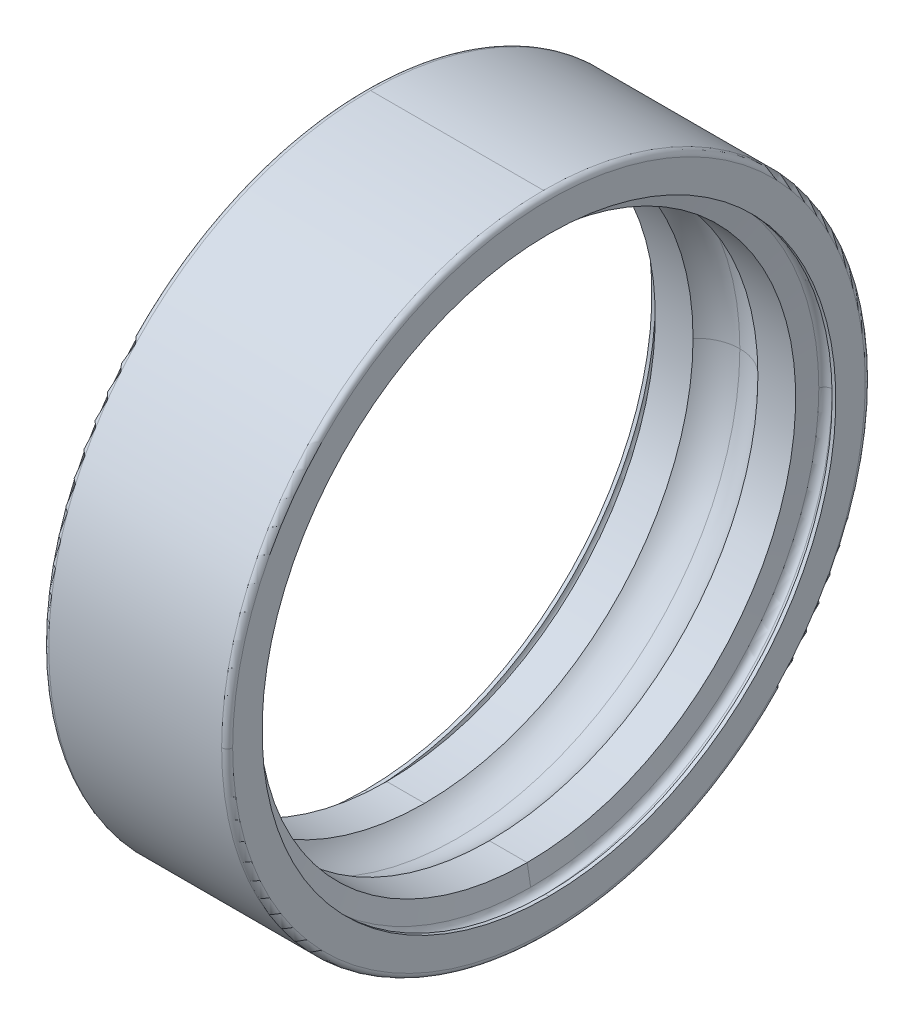
ISO-10303-21;
HEADER;
FILE_DESCRIPTION(('STEP AP214'),'2;1');
FILE_NAME('part.step','',(''),(''),'','','');
FILE_SCHEMA(('AUTOMOTIVE_DESIGN { 1 0 10303 214 1 1 1 1 }'));
ENDSEC;
DATA;
#1=APPLICATION_CONTEXT('core data for automotive mechanical design processes');
#2=APPLICATION_PROTOCOL_DEFINITION('international standard','automotive_design',2000,#1);
#3=PRODUCT_CONTEXT('',#1,'mechanical');
#4=PRODUCT('Part','Part','',(#3));
#5=PRODUCT_RELATED_PRODUCT_CATEGORY('part','',(#4));
#6=PRODUCT_DEFINITION_FORMATION('','',#4);
#7=PRODUCT_DEFINITION_CONTEXT('part definition',#1,'design');
#8=PRODUCT_DEFINITION('design','',#6,#7);
#9=PRODUCT_DEFINITION_SHAPE('','',#8);
#10=(LENGTH_UNIT() NAMED_UNIT(*) SI_UNIT(.MILLI.,.METRE.));
#11=(NAMED_UNIT(*) PLANE_ANGLE_UNIT() SI_UNIT($,.RADIAN.));
#12=(NAMED_UNIT(*) SI_UNIT($,.STERADIAN.) SOLID_ANGLE_UNIT());
#13=UNCERTAINTY_MEASURE_WITH_UNIT(LENGTH_MEASURE(1.E-05),#10,'distance_accuracy_value','');
#14=(GEOMETRIC_REPRESENTATION_CONTEXT(3) GLOBAL_UNCERTAINTY_ASSIGNED_CONTEXT((#13)) GLOBAL_UNIT_ASSIGNED_CONTEXT((#10,
#11,#12)) REPRESENTATION_CONTEXT('',''));
#15=CARTESIAN_POINT('',(0.,0.,0.));
#16=DIRECTION('',(0.,0.,1.));
#17=DIRECTION('',(1.,0.,0.));
#18=AXIS2_PLACEMENT_3D('',#15,#16,#17);
#19=CARTESIAN_POINT('',(9.4,0.,0.));
#20=DIRECTION('',(1.,0.,0.));
#21=DIRECTION('',(0.,0.,-1.));
#22=AXIS2_PLACEMENT_3D('',#19,#20,#21);
#23=TOROIDAL_SURFACE('',#22,15.6,0.4);
#24=CARTESIAN_POINT('',(9.4,0.,0.));
#25=DIRECTION('',(1.,0.,0.));
#26=DIRECTION('',(0.,0.,1.));
#27=AXIS2_PLACEMENT_3D('',#24,#25,#26);
#28=CIRCLE('',#27,16.);
#29=CARTESIAN_POINT('',(9.4,0.,-16.));
#30=VERTEX_POINT('',#29);
#31=CARTESIAN_POINT('',(9.4,0.,16.));
#32=VERTEX_POINT('',#31);
#33=EDGE_CURVE('E415',#30,#32,#28,.T.);
#34=ORIENTED_EDGE('',*,*,#33,.T.);
#35=CARTESIAN_POINT('',(9.4,0.,15.6));
#36=DIRECTION('',(0.,-1.,0.));
#37=DIRECTION('',(0.,0.,1.));
#38=AXIS2_PLACEMENT_3D('',#35,#36,#37);
#39=CIRCLE('',#38,0.4);
#40=CARTESIAN_POINT('',(9.00607689879512,0.,15.6694592710668));
#41=VERTEX_POINT('',#40);
#42=EDGE_CURVE('E300',#32,#41,#39,.T.);
#43=ORIENTED_EDGE('',*,*,#42,.T.);
#44=CARTESIAN_POINT('',(9.00607689879512,0.,0.));
#45=DIRECTION('',(1.,0.,0.));
#46=DIRECTION('',(0.,1.,0.));
#47=AXIS2_PLACEMENT_3D('',#44,#45,#46);
#48=CIRCLE('',#47,15.6694592710668);
#49=CARTESIAN_POINT('',(9.00607689879512,15.6694592710668,0.));
#50=VERTEX_POINT('',#49);
#51=EDGE_CURVE('E31',#50,#41,#48,.T.);
#52=ORIENTED_EDGE('',*,*,#51,.F.);
#53=CARTESIAN_POINT('',(9.00607689879512,0.,0.));
#54=DIRECTION('',(1.,0.,0.));
#55=DIRECTION('',(0.,1.,0.));
#56=AXIS2_PLACEMENT_3D('',#53,#54,#55);
#57=CIRCLE('',#56,15.6694592710668);
#58=CARTESIAN_POINT('',(9.00607689879512,0.,-15.6694592710668));
#59=VERTEX_POINT('',#58);
#60=EDGE_CURVE('E215',#59,#50,#57,.T.);
#61=ORIENTED_EDGE('',*,*,#60,.F.);
#62=CARTESIAN_POINT('',(9.4,0.,-15.6));
#63=DIRECTION('',(0.,-1.,0.));
#64=DIRECTION('',(0.,0.,-1.));
#65=AXIS2_PLACEMENT_3D('',#62,#63,#64);
#66=CIRCLE('',#65,0.4);
#67=EDGE_CURVE('E289',#59,#30,#66,.T.);
#68=ORIENTED_EDGE('',*,*,#67,.T.);
#69=EDGE_LOOP('',(#34,#43,#52,#61,#68));
#70=FACE_BOUND('',#69,.T.);
#71=ADVANCED_FACE('F16',(#70),#23,.F.);
#72=CARTESIAN_POINT('',(9.9,0.,0.));
#73=DIRECTION('',(1.,0.,0.));
#74=DIRECTION('',(0.,1.,0.));
#75=AXIS2_PLACEMENT_3D('',#72,#73,#74);
#76=CYLINDRICAL_SURFACE('',#75,15.6);
#77=DIRECTION('',(1.,0.,0.));
#78=VECTOR('',#77,1.);
#79=CARTESIAN_POINT('',(9.9,15.6,0.));
#80=LINE('',#79,#78);
#81=CARTESIAN_POINT('',(9.8,15.6,0.));
#82=VERTEX_POINT('',#81);
#83=CARTESIAN_POINT('',(10.,15.6,0.));
#84=VERTEX_POINT('',#83);
#85=EDGE_CURVE('E302',#82,#84,#80,.T.);
#86=ORIENTED_EDGE('',*,*,#85,.T.);
#87=CARTESIAN_POINT('',(10.,0.,0.));
#88=DIRECTION('',(1.,0.,0.));
#89=DIRECTION('',(0.,1.,0.));
#90=AXIS2_PLACEMENT_3D('',#87,#88,#89);
#91=CIRCLE('',#90,15.6);
#92=CARTESIAN_POINT('',(10.,-15.6,0.));
#93=VERTEX_POINT('',#92);
#94=EDGE_CURVE('E11',#84,#93,#91,.T.);
#95=ORIENTED_EDGE('',*,*,#94,.T.);
#96=DIRECTION('',(-1.,0.,0.));
#97=VECTOR('',#96,1.);
#98=CARTESIAN_POINT('',(9.9,-15.6,0.));
#99=LINE('',#98,#97);
#100=CARTESIAN_POINT('',(9.8,-15.6,0.));
#101=VERTEX_POINT('',#100);
#102=EDGE_CURVE('E307',#93,#101,#99,.T.);
#103=ORIENTED_EDGE('',*,*,#102,.T.);
#104=CARTESIAN_POINT('',(9.8,0.,0.));
#105=DIRECTION('',(1.,0.,0.));
#106=DIRECTION('',(0.,1.,0.));
#107=AXIS2_PLACEMENT_3D('',#104,#105,#106);
#108=CIRCLE('',#107,15.6);
#109=CARTESIAN_POINT('',(9.8,0.,15.6));
#110=VERTEX_POINT('',#109);
#111=EDGE_CURVE('E278',#110,#101,#108,.T.);
#112=ORIENTED_EDGE('',*,*,#111,.F.);
#113=CARTESIAN_POINT('',(9.8,0.,0.));
#114=DIRECTION('',(1.,0.,0.));
#115=DIRECTION('',(0.,1.,0.));
#116=AXIS2_PLACEMENT_3D('',#113,#114,#115);
#117=CIRCLE('',#116,15.6);
#118=EDGE_CURVE('E379',#82,#110,#117,.T.);
#119=ORIENTED_EDGE('',*,*,#118,.F.);
#120=EDGE_LOOP('',(#86,#95,#103,#112,#119));
#121=FACE_BOUND('',#120,.T.);
#122=ADVANCED_FACE('F439',(#121),#76,.F.);
#123=CARTESIAN_POINT('',(10.,16.4,0.));
#124=DIRECTION('',(1.,0.,0.));
#125=DIRECTION('',(0.,1.,0.));
#126=AXIS2_PLACEMENT_3D('',#123,#124,#125);
#127=PLANE('',#126);
#128=ORIENTED_EDGE('',*,*,#94,.F.);
#129=CARTESIAN_POINT('',(10.,0.,0.));
#130=DIRECTION('',(1.,0.,0.));
#131=DIRECTION('',(0.,1.,0.));
#132=AXIS2_PLACEMENT_3D('',#129,#130,#131);
#133=CIRCLE('',#132,15.6);
#134=EDGE_CURVE('E310',#93,#84,#133,.T.);
#135=ORIENTED_EDGE('',*,*,#134,.F.);
#136=EDGE_LOOP('',(#128,#135));
#137=FACE_BOUND('',#136,.T.);
#138=CARTESIAN_POINT('',(10.,0.,0.));
#139=DIRECTION('',(1.,0.,0.));
#140=DIRECTION('',(0.,1.,0.));
#141=AXIS2_PLACEMENT_3D('',#138,#139,#140);
#142=CIRCLE('',#141,17.2);
#143=CARTESIAN_POINT('',(10.,0.,17.2));
#144=VERTEX_POINT('',#143);
#145=CARTESIAN_POINT('',(10.,0.,-17.2));
#146=VERTEX_POINT('',#145);
#147=EDGE_CURVE('E19',#144,#146,#142,.T.);
#148=ORIENTED_EDGE('',*,*,#147,.T.);
#149=CARTESIAN_POINT('',(10.,0.,0.));
#150=DIRECTION('',(1.,0.,0.));
#151=DIRECTION('',(0.,1.,0.));
#152=AXIS2_PLACEMENT_3D('',#149,#150,#151);
#153=CIRCLE('',#152,17.2);
#154=EDGE_CURVE('E323',#146,#144,#153,.T.);
#155=ORIENTED_EDGE('',*,*,#154,.T.);
#156=EDGE_LOOP('',(#148,#155));
#157=FACE_BOUND('',#156,.T.);
#158=ADVANCED_FACE('F441',(#137,#157),#127,.T.);
#159=CARTESIAN_POINT('',(9.7,0.,0.));
#160=DIRECTION('',(1.,0.,0.));
#161=DIRECTION('',(0.,0.,-1.));
#162=AXIS2_PLACEMENT_3D('',#159,#160,#161);
#163=TOROIDAL_SURFACE('',#162,17.2,0.3);
#164=CARTESIAN_POINT('',(9.7,0.,-17.2));
#165=DIRECTION('',(0.,-1.,0.));
#166=DIRECTION('',(0.,0.,-1.));
#167=AXIS2_PLACEMENT_3D('',#164,#165,#166);
#168=CIRCLE('',#167,0.3);
#169=CARTESIAN_POINT('',(9.7,0.,-17.5));
#170=VERTEX_POINT('',#169);
#171=EDGE_CURVE('E313',#170,#146,#168,.T.);
#172=ORIENTED_EDGE('',*,*,#171,.T.);
#173=ORIENTED_EDGE('',*,*,#147,.F.);
#174=CARTESIAN_POINT('',(9.7,0.,17.2));
#175=DIRECTION('',(0.,-1.,0.));
#176=DIRECTION('',(0.,0.,1.));
#177=AXIS2_PLACEMENT_3D('',#174,#175,#176);
#178=CIRCLE('',#177,0.3);
#179=CARTESIAN_POINT('',(9.7,0.,17.5));
#180=VERTEX_POINT('',#179);
#181=EDGE_CURVE('E320',#144,#180,#178,.T.);
#182=ORIENTED_EDGE('',*,*,#181,.T.);
#183=CARTESIAN_POINT('',(9.7,0.,0.));
#184=DIRECTION('',(1.,0.,0.));
#185=DIRECTION('',(0.,1.,0.));
#186=AXIS2_PLACEMENT_3D('',#183,#184,#185);
#187=CIRCLE('',#186,17.5);
#188=CARTESIAN_POINT('',(9.7,-17.5,0.));
#189=VERTEX_POINT('',#188);
#190=EDGE_CURVE('E336',#180,#189,#187,.T.);
#191=ORIENTED_EDGE('',*,*,#190,.T.);
#192=CARTESIAN_POINT('',(9.7,0.,0.));
#193=DIRECTION('',(1.,0.,0.));
#194=DIRECTION('',(0.,1.,0.));
#195=AXIS2_PLACEMENT_3D('',#192,#193,#194);
#196=CIRCLE('',#195,17.5);
#197=EDGE_CURVE('E222',#189,#170,#196,.T.);
#198=ORIENTED_EDGE('',*,*,#197,.T.);
#199=EDGE_LOOP('',(#172,#173,#182,#191,#198));
#200=FACE_BOUND('',#199,.T.);
#201=ADVANCED_FACE('F444',(#200),#163,.T.);
#202=CARTESIAN_POINT('',(5.,0.,0.));
#203=DIRECTION('',(1.,0.,0.));
#204=DIRECTION('',(0.,1.,0.));
#205=AXIS2_PLACEMENT_3D('',#202,#203,#204);
#206=CYLINDRICAL_SURFACE('',#205,17.5);
#207=DIRECTION('',(1.,0.,0.));
#208=VECTOR('',#207,1.);
#209=CARTESIAN_POINT('',(5.,17.5,0.));
#210=LINE('',#209,#208);
#211=CARTESIAN_POINT('',(0.3,17.5,0.));
#212=VERTEX_POINT('',#211);
#213=CARTESIAN_POINT('',(9.7,17.5,0.));
#214=VERTEX_POINT('',#213);
#215=EDGE_CURVE('E326',#212,#214,#210,.T.);
#216=ORIENTED_EDGE('',*,*,#215,.T.);
#217=CARTESIAN_POINT('',(9.7,0.,0.));
#218=DIRECTION('',(1.,0.,0.));
#219=DIRECTION('',(0.,1.,0.));
#220=AXIS2_PLACEMENT_3D('',#217,#218,#219);
#221=CIRCLE('',#220,17.5);
#222=EDGE_CURVE('E314',#170,#214,#221,.T.);
#223=ORIENTED_EDGE('',*,*,#222,.F.);
#224=ORIENTED_EDGE('',*,*,#197,.F.);
#225=DIRECTION('',(-1.,0.,0.));
#226=VECTOR('',#225,1.);
#227=CARTESIAN_POINT('',(5.,-17.5,0.));
#228=LINE('',#227,#226);
#229=CARTESIAN_POINT('',(0.3,-17.5,0.));
#230=VERTEX_POINT('',#229);
#231=EDGE_CURVE('E334',#189,#230,#228,.T.);
#232=ORIENTED_EDGE('',*,*,#231,.T.);
#233=CARTESIAN_POINT('',(0.3,0.,0.));
#234=DIRECTION('',(1.,0.,0.));
#235=DIRECTION('',(0.,1.,0.));
#236=AXIS2_PLACEMENT_3D('',#233,#234,#235);
#237=CIRCLE('',#236,17.5);
#238=CARTESIAN_POINT('',(0.3,0.,-17.5));
#239=VERTEX_POINT('',#238);
#240=EDGE_CURVE('E221',#230,#239,#237,.T.);
#241=ORIENTED_EDGE('',*,*,#240,.T.);
#242=CARTESIAN_POINT('',(0.3,0.,0.));
#243=DIRECTION('',(1.,0.,0.));
#244=DIRECTION('',(0.,1.,0.));
#245=AXIS2_PLACEMENT_3D('',#242,#243,#244);
#246=CIRCLE('',#245,17.5);
#247=EDGE_CURVE('E347',#239,#212,#246,.T.);
#248=ORIENTED_EDGE('',*,*,#247,.T.);
#249=EDGE_LOOP('',(#216,#223,#224,#232,#241,#248));
#250=FACE_BOUND('',#249,.T.);
#251=ADVANCED_FACE('F452',(#250),#206,.T.);
#252=CARTESIAN_POINT('',(0.3,0.,0.));
#253=DIRECTION('',(1.,0.,0.));
#254=DIRECTION('',(0.,0.,-1.));
#255=AXIS2_PLACEMENT_3D('',#252,#253,#254);
#256=TOROIDAL_SURFACE('',#255,17.2,0.3);
#257=CARTESIAN_POINT('',(0.3,0.,-17.2));
#258=DIRECTION('',(0.,-1.,0.));
#259=DIRECTION('',(0.,0.,-1.));
#260=AXIS2_PLACEMENT_3D('',#257,#258,#259);
#261=CIRCLE('',#260,0.3);
#262=CARTESIAN_POINT('',(0.,0.,-17.2));
#263=VERTEX_POINT('',#262);
#264=EDGE_CURVE('E338',#263,#239,#261,.T.);
#265=ORIENTED_EDGE('',*,*,#264,.T.);
#266=ORIENTED_EDGE('',*,*,#240,.F.);
#267=CARTESIAN_POINT('',(0.3,0.,0.));
#268=DIRECTION('',(1.,0.,0.));
#269=DIRECTION('',(0.,1.,0.));
#270=AXIS2_PLACEMENT_3D('',#267,#268,#269);
#271=CIRCLE('',#270,17.5);
#272=CARTESIAN_POINT('',(0.3,0.,17.5));
#273=VERTEX_POINT('',#272);
#274=EDGE_CURVE('E331',#273,#230,#271,.T.);
#275=ORIENTED_EDGE('',*,*,#274,.F.);
#276=CARTESIAN_POINT('',(0.3,0.,17.2));
#277=DIRECTION('',(0.,-1.,0.));
#278=DIRECTION('',(0.,0.,1.));
#279=AXIS2_PLACEMENT_3D('',#276,#277,#278);
#280=CIRCLE('',#279,0.3);
#281=CARTESIAN_POINT('',(0.,0.,17.2));
#282=VERTEX_POINT('',#281);
#283=EDGE_CURVE('E344',#273,#282,#280,.T.);
#284=ORIENTED_EDGE('',*,*,#283,.T.);
#285=CARTESIAN_POINT('',(0.,0.,0.));
#286=DIRECTION('',(1.,0.,0.));
#287=DIRECTION('',(0.,1.,0.));
#288=AXIS2_PLACEMENT_3D('',#285,#286,#287);
#289=CIRCLE('',#288,17.2);
#290=EDGE_CURVE('E219',#282,#263,#289,.T.);
#291=ORIENTED_EDGE('',*,*,#290,.T.);
#292=EDGE_LOOP('',(#265,#266,#275,#284,#291));
#293=FACE_BOUND('',#292,.T.);
#294=ADVANCED_FACE('F458',(#293),#256,.T.);
#295=CARTESIAN_POINT('',(0.,16.4,0.));
#296=DIRECTION('',(-1.,0.,0.));
#297=DIRECTION('',(0.,0.,1.));
#298=AXIS2_PLACEMENT_3D('',#295,#296,#297);
#299=PLANE('',#298);
#300=CARTESIAN_POINT('',(0.,0.,0.));
#301=DIRECTION('',(1.,0.,0.));
#302=DIRECTION('',(0.,1.,0.));
#303=AXIS2_PLACEMENT_3D('',#300,#301,#302);
#304=CIRCLE('',#303,15.6);
#305=CARTESIAN_POINT('',(0.,15.6,0.));
#306=VERTEX_POINT('',#305);
#307=CARTESIAN_POINT('',(0.,-15.6,0.));
#308=VERTEX_POINT('',#307);
#309=EDGE_CURVE('E217',#306,#308,#304,.T.);
#310=ORIENTED_EDGE('',*,*,#309,.T.);
#311=CARTESIAN_POINT('',(0.,0.,0.));
#312=DIRECTION('',(1.,0.,0.));
#313=DIRECTION('',(0.,1.,0.));
#314=AXIS2_PLACEMENT_3D('',#311,#312,#313);
#315=CIRCLE('',#314,15.6);
#316=EDGE_CURVE('E249',#308,#306,#315,.T.);
#317=ORIENTED_EDGE('',*,*,#316,.T.);
#318=EDGE_LOOP('',(#310,#317));
#319=FACE_BOUND('',#318,.T.);
#320=CARTESIAN_POINT('',(0.,0.,0.));
#321=DIRECTION('',(1.,0.,0.));
#322=DIRECTION('',(0.,1.,0.));
#323=AXIS2_PLACEMENT_3D('',#320,#321,#322);
#324=CIRCLE('',#323,17.2);
#325=EDGE_CURVE('E341',#263,#282,#324,.T.);
#326=ORIENTED_EDGE('',*,*,#325,.F.);
#327=ORIENTED_EDGE('',*,*,#290,.F.);
#328=EDGE_LOOP('',(#326,#327));
#329=FACE_BOUND('',#328,.T.);
#330=ADVANCED_FACE('F494',(#319,#329),#299,.T.);
#331=CARTESIAN_POINT('',(0.1,0.,0.));
#332=DIRECTION('',(1.,0.,0.));
#333=DIRECTION('',(0.,1.,0.));
#334=AXIS2_PLACEMENT_3D('',#331,#332,#333);
#335=CYLINDRICAL_SURFACE('',#334,15.6);
#336=DIRECTION('',(1.,0.,0.));
#337=VECTOR('',#336,1.);
#338=CARTESIAN_POINT('',(0.1,15.6,0.));
#339=LINE('',#338,#337);
#340=CARTESIAN_POINT('',(0.2,15.6,0.));
#341=VERTEX_POINT('',#340);
#342=EDGE_CURVE('E253',#306,#341,#339,.T.);
#343=ORIENTED_EDGE('',*,*,#342,.T.);
#344=CARTESIAN_POINT('',(0.2,0.,0.));
#345=DIRECTION('',(1.,0.,0.));
#346=DIRECTION('',(0.,1.,0.));
#347=AXIS2_PLACEMENT_3D('',#344,#345,#346);
#348=CIRCLE('',#347,15.6);
#349=CARTESIAN_POINT('',(0.2,0.,15.6));
#350=VERTEX_POINT('',#349);
#351=EDGE_CURVE('E220',#341,#350,#348,.T.);
#352=ORIENTED_EDGE('',*,*,#351,.T.);
#353=CARTESIAN_POINT('',(0.2,0.,0.));
#354=DIRECTION('',(1.,0.,0.));
#355=DIRECTION('',(0.,1.,0.));
#356=AXIS2_PLACEMENT_3D('',#353,#354,#355);
#357=CIRCLE('',#356,15.6);
#358=CARTESIAN_POINT('',(0.2,-15.6,0.));
#359=VERTEX_POINT('',#358);
#360=EDGE_CURVE('E283',#350,#359,#357,.T.);
#361=ORIENTED_EDGE('',*,*,#360,.T.);
#362=DIRECTION('',(-1.,0.,0.));
#363=VECTOR('',#362,1.);
#364=CARTESIAN_POINT('',(0.1,-15.6,0.));
#365=LINE('',#364,#363);
#366=EDGE_CURVE('E252',#359,#308,#365,.T.);
#367=ORIENTED_EDGE('',*,*,#366,.T.);
#368=ORIENTED_EDGE('',*,*,#309,.F.);
#369=EDGE_LOOP('',(#343,#352,#361,#367,#368));
#370=FACE_BOUND('',#369,.T.);
#371=ADVANCED_FACE('F504',(#370),#335,.F.);
#372=CARTESIAN_POINT('',(0.6,0.,0.));
#373=DIRECTION('',(1.,0.,0.));
#374=DIRECTION('',(0.,0.,-1.));
#375=AXIS2_PLACEMENT_3D('',#372,#373,#374);
#376=TOROIDAL_SURFACE('',#375,15.6,0.4);
#377=CARTESIAN_POINT('',(0.6,0.,0.));
#378=DIRECTION('',(1.,0.,0.));
#379=DIRECTION('',(0.,0.,1.));
#380=AXIS2_PLACEMENT_3D('',#377,#378,#379);
#381=CIRCLE('',#380,16.);
#382=CARTESIAN_POINT('',(0.6,0.,-16.));
#383=VERTEX_POINT('',#382);
#384=CARTESIAN_POINT('',(0.6,0.,16.));
#385=VERTEX_POINT('',#384);
#386=EDGE_CURVE('E387',#383,#385,#381,.T.);
#387=ORIENTED_EDGE('',*,*,#386,.T.);
#388=CARTESIAN_POINT('',(0.6,0.,15.6));
#389=DIRECTION('',(0.,-1.,0.));
#390=DIRECTION('',(0.,0.,1.));
#391=AXIS2_PLACEMENT_3D('',#388,#389,#390);
#392=CIRCLE('',#391,0.4);
#393=EDGE_CURVE('E279',#385,#350,#392,.T.);
#394=ORIENTED_EDGE('',*,*,#393,.T.);
#395=ORIENTED_EDGE('',*,*,#351,.F.);
#396=CARTESIAN_POINT('',(0.2,0.,0.));
#397=DIRECTION('',(1.,0.,0.));
#398=DIRECTION('',(0.,1.,0.));
#399=AXIS2_PLACEMENT_3D('',#396,#397,#398);
#400=CIRCLE('',#399,15.6);
#401=CARTESIAN_POINT('',(0.2,0.,-15.6));
#402=VERTEX_POINT('',#401);
#403=EDGE_CURVE('E266',#402,#341,#400,.T.);
#404=ORIENTED_EDGE('',*,*,#403,.F.);
#405=CARTESIAN_POINT('',(0.6,0.,-15.6));
#406=DIRECTION('',(0.,-1.,0.));
#407=DIRECTION('',(0.,0.,-1.));
#408=AXIS2_PLACEMENT_3D('',#405,#406,#407);
#409=CIRCLE('',#408,0.4);
#410=EDGE_CURVE('E269',#402,#383,#409,.T.);
#411=ORIENTED_EDGE('',*,*,#410,.T.);
#412=EDGE_LOOP('',(#387,#394,#395,#404,#411));
#413=FACE_BOUND('',#412,.T.);
#414=ADVANCED_FACE('F514',(#413),#376,.F.);
#415=CARTESIAN_POINT('',(1.08821036333382,0.,0.));
#416=DIRECTION('',(-1.,0.,0.));
#417=DIRECTION('',(0.,1.,0.));
#418=AXIS2_PLACEMENT_3D('',#415,#416,#417);
#419=CONICAL_SURFACE('',#418,15.1347296355334,1.39626340159546);
#420=DIRECTION('',(0.17364817766693,-0.984807753012208,0.));
#421=VECTOR('',#420,1.);
#422=CARTESIAN_POINT('',(1.08821036333382,15.1347296355334,0.));
#423=LINE('',#422,#421);
#424=CARTESIAN_POINT('',(0.993923101204883,15.6694592710668,0.));
#425=VERTEX_POINT('',#424);
#426=CARTESIAN_POINT('',(1.18249762546276,14.6,0.));
#427=VERTEX_POINT('',#426);
#428=EDGE_CURVE('E282',#425,#427,#423,.T.);
#429=ORIENTED_EDGE('',*,*,#428,.T.);
#430=CARTESIAN_POINT('',(1.18249762546276,0.,0.));
#431=DIRECTION('',(1.,0.,0.));
#432=DIRECTION('',(0.,1.,0.));
#433=AXIS2_PLACEMENT_3D('',#430,#431,#432);
#434=CIRCLE('',#433,14.6);
#435=CARTESIAN_POINT('',(1.18249762546276,-14.6,0.));
#436=VERTEX_POINT('',#435);
#437=EDGE_CURVE('E182',#427,#436,#434,.T.);
#438=ORIENTED_EDGE('',*,*,#437,.T.);
#439=DIRECTION('',(-0.17364817766693,-0.984807753012208,0.));
#440=VECTOR('',#439,1.);
#441=CARTESIAN_POINT('',(1.08821036333382,-15.1347296355334,0.));
#442=LINE('',#441,#440);
#443=CARTESIAN_POINT('',(0.993923101204883,-15.6694592710668,0.));
#444=VERTEX_POINT('',#443);
#445=EDGE_CURVE('E293',#436,#444,#442,.T.);
#446=ORIENTED_EDGE('',*,*,#445,.T.);
#447=CARTESIAN_POINT('',(0.993923101204883,0.,0.));
#448=DIRECTION('',(1.,0.,0.));
#449=DIRECTION('',(0.,1.,0.));
#450=AXIS2_PLACEMENT_3D('',#447,#448,#449);
#451=CIRCLE('',#450,15.6694592710668);
#452=CARTESIAN_POINT('',(0.993923101204883,0.,15.6694592710668));
#453=VERTEX_POINT('',#452);
#454=EDGE_CURVE('E265',#453,#444,#451,.T.);
#455=ORIENTED_EDGE('',*,*,#454,.F.);
#456=CARTESIAN_POINT('',(0.993923101204883,0.,0.));
#457=DIRECTION('',(1.,0.,0.));
#458=DIRECTION('',(0.,1.,0.));
#459=AXIS2_PLACEMENT_3D('',#456,#457,#458);
#460=CIRCLE('',#459,15.6694592710668);
#461=EDGE_CURVE('E233',#425,#453,#460,.T.);
#462=ORIENTED_EDGE('',*,*,#461,.F.);
#463=EDGE_LOOP('',(#429,#438,#446,#455,#462));
#464=FACE_BOUND('',#463,.T.);
#465=ADVANCED_FACE('F523',(#464),#419,.F.);
#466=CARTESIAN_POINT('',(2.20960815463989,0.,0.));
#467=DIRECTION('',(1.,0.,0.));
#468=DIRECTION('',(0.,1.,0.));
#469=AXIS2_PLACEMENT_3D('',#466,#467,#468);
#470=CYLINDRICAL_SURFACE('',#469,14.6);
#471=DIRECTION('',(1.,0.,0.));
#472=VECTOR('',#471,1.);
#473=CARTESIAN_POINT('',(2.20960815463989,14.6,0.));
#474=LINE('',#473,#472);
#475=CARTESIAN_POINT('',(3.23671868381702,14.6,0.));
#476=VERTEX_POINT('',#475);
#477=EDGE_CURVE('E178',#427,#476,#474,.T.);
#478=ORIENTED_EDGE('',*,*,#477,.T.);
#479=CARTESIAN_POINT('',(3.23671868381702,0.,0.));
#480=DIRECTION('',(1.,0.,0.));
#481=DIRECTION('',(0.,1.,0.));
#482=AXIS2_PLACEMENT_3D('',#479,#480,#481);
#483=CIRCLE('',#482,14.6);
#484=CARTESIAN_POINT('',(3.23671868381702,0.,14.6));
#485=VERTEX_POINT('',#484);
#486=EDGE_CURVE('E170',#476,#485,#483,.T.);
#487=ORIENTED_EDGE('',*,*,#486,.T.);
#488=CARTESIAN_POINT('',(3.23671868381702,0.,0.));
#489=DIRECTION('',(1.,0.,0.));
#490=DIRECTION('',(0.,1.,0.));
#491=AXIS2_PLACEMENT_3D('',#488,#489,#490);
#492=CIRCLE('',#491,14.6);
#493=CARTESIAN_POINT('',(3.23671868381702,-14.6,0.));
#494=VERTEX_POINT('',#493);
#495=EDGE_CURVE('E175',#485,#494,#492,.T.);
#496=ORIENTED_EDGE('',*,*,#495,.T.);
#497=DIRECTION('',(-1.,0.,0.));
#498=VECTOR('',#497,1.);
#499=CARTESIAN_POINT('',(2.20960815463989,-14.6,0.));
#500=LINE('',#499,#498);
#501=EDGE_CURVE('E304',#494,#436,#500,.T.);
#502=ORIENTED_EDGE('',*,*,#501,.T.);
#503=ORIENTED_EDGE('',*,*,#437,.F.);
#504=EDGE_LOOP('',(#478,#487,#496,#502,#503));
#505=FACE_BOUND('',#504,.T.);
#506=ADVANCED_FACE('F172',(#505),#470,.F.);
#507=CARTESIAN_POINT('',(5.,0.,0.));
#508=DIRECTION('',(1.,0.,0.));
#509=DIRECTION('',(0.,0.,-1.));
#510=AXIS2_PLACEMENT_3D('',#507,#508,#509);
#511=TOROIDAL_SURFACE('',#510,13.,2.381);
#512=CARTESIAN_POINT('',(5.,0.,0.));
#513=DIRECTION('',(1.,0.,0.));
#514=DIRECTION('',(0.,0.,1.));
#515=AXIS2_PLACEMENT_3D('',#512,#513,#514);
#516=CIRCLE('',#515,15.381);
#517=CARTESIAN_POINT('',(5.,0.,-15.381));
#518=VERTEX_POINT('',#517);
#519=CARTESIAN_POINT('',(5.,0.,15.381));
#520=VERTEX_POINT('',#519);
#521=EDGE_CURVE('E189',#518,#520,#516,.T.);
#522=ORIENTED_EDGE('',*,*,#521,.T.);
#523=CARTESIAN_POINT('',(5.,0.,13.));
#524=DIRECTION('',(0.,-1.,0.));
#525=DIRECTION('',(0.,0.,1.));
#526=AXIS2_PLACEMENT_3D('',#523,#524,#525);
#527=CIRCLE('',#526,2.381);
#528=EDGE_CURVE('E185',#520,#485,#527,.T.);
#529=ORIENTED_EDGE('',*,*,#528,.T.);
#530=ORIENTED_EDGE('',*,*,#486,.F.);
#531=CARTESIAN_POINT('',(3.23671868381702,0.,0.));
#532=DIRECTION('',(1.,0.,0.));
#533=DIRECTION('',(0.,1.,0.));
#534=AXIS2_PLACEMENT_3D('',#531,#532,#533);
#535=CIRCLE('',#534,14.6);
#536=CARTESIAN_POINT('',(3.23671868381702,0.,-14.6));
#537=VERTEX_POINT('',#536);
#538=EDGE_CURVE('E201',#537,#476,#535,.T.);
#539=ORIENTED_EDGE('',*,*,#538,.F.);
#540=CARTESIAN_POINT('',(5.,0.,-13.));
#541=DIRECTION('',(0.,-1.,0.));
#542=DIRECTION('',(0.,0.,-1.));
#543=AXIS2_PLACEMENT_3D('',#540,#541,#542);
#544=CIRCLE('',#543,2.381);
#545=EDGE_CURVE('E199',#537,#518,#544,.T.);
#546=ORIENTED_EDGE('',*,*,#545,.T.);
#547=EDGE_LOOP('',(#522,#529,#530,#539,#546));
#548=FACE_BOUND('',#547,.T.);
#549=ADVANCED_FACE('F186',(#548),#511,.F.);
#550=CARTESIAN_POINT('',(7.79039184536011,0.,0.));
#551=DIRECTION('',(1.,0.,0.));
#552=DIRECTION('',(0.,1.,0.));
#553=AXIS2_PLACEMENT_3D('',#550,#551,#552);
#554=CYLINDRICAL_SURFACE('',#553,14.6);
#555=DIRECTION('',(1.,0.,0.));
#556=VECTOR('',#555,1.);
#557=CARTESIAN_POINT('',(7.79039184536011,14.6,0.));
#558=LINE('',#557,#556);
#559=CARTESIAN_POINT('',(6.76328131618298,14.6,0.));
#560=VERTEX_POINT('',#559);
#561=CARTESIAN_POINT('',(8.81750237453724,14.6,0.));
#562=VERTEX_POINT('',#561);
#563=EDGE_CURVE('E193',#560,#562,#558,.T.);
#564=ORIENTED_EDGE('',*,*,#563,.T.);
#565=CARTESIAN_POINT('',(8.81750237453724,0.,0.));
#566=DIRECTION('',(1.,0.,0.));
#567=DIRECTION('',(0.,1.,0.));
#568=AXIS2_PLACEMENT_3D('',#565,#566,#567);
#569=CIRCLE('',#568,14.6);
#570=CARTESIAN_POINT('',(8.81750237453724,-14.6,0.));
#571=VERTEX_POINT('',#570);
#572=EDGE_CURVE('E40',#562,#571,#569,.T.);
#573=ORIENTED_EDGE('',*,*,#572,.T.);
#574=DIRECTION('',(-1.,0.,0.));
#575=VECTOR('',#574,1.);
#576=CARTESIAN_POINT('',(7.79039184536011,-14.6,0.));
#577=LINE('',#576,#575);
#578=CARTESIAN_POINT('',(6.76328131618298,-14.6,0.));
#579=VERTEX_POINT('',#578);
#580=EDGE_CURVE('E205',#571,#579,#577,.T.);
#581=ORIENTED_EDGE('',*,*,#580,.T.);
#582=CARTESIAN_POINT('',(6.76328131618298,0.,0.));
#583=DIRECTION('',(1.,0.,0.));
#584=DIRECTION('',(0.,1.,0.));
#585=AXIS2_PLACEMENT_3D('',#582,#583,#584);
#586=CIRCLE('',#585,14.6);
#587=CARTESIAN_POINT('',(6.76328131618298,0.,14.6));
#588=VERTEX_POINT('',#587);
#589=EDGE_CURVE('E254',#588,#579,#586,.T.);
#590=ORIENTED_EDGE('',*,*,#589,.F.);
#591=CARTESIAN_POINT('',(6.76328131618298,0.,0.));
#592=DIRECTION('',(1.,0.,0.));
#593=DIRECTION('',(0.,1.,0.));
#594=AXIS2_PLACEMENT_3D('',#591,#592,#593);
#595=CIRCLE('',#594,14.6);
#596=EDGE_CURVE('E241',#560,#588,#595,.T.);
#597=ORIENTED_EDGE('',*,*,#596,.F.);
#598=EDGE_LOOP('',(#564,#573,#581,#590,#597));
#599=FACE_BOUND('',#598,.T.);
#600=ADVANCED_FACE('F549',(#599),#554,.F.);
#601=CARTESIAN_POINT('',(8.91178963666618,0.,0.));
#602=DIRECTION('',(1.,0.,0.));
#603=DIRECTION('',(0.,1.,0.));
#604=AXIS2_PLACEMENT_3D('',#601,#602,#603);
#605=CONICAL_SURFACE('',#604,15.1347296355334,1.39626340159546);
#606=DIRECTION('',(0.173648177666932,0.984807753012208,0.));
#607=VECTOR('',#606,1.);
#608=CARTESIAN_POINT('',(8.91178963666618,15.1347296355334,0.));
#609=LINE('',#608,#607);
#610=EDGE_CURVE('E210',#562,#50,#609,.T.);
#611=ORIENTED_EDGE('',*,*,#610,.T.);
#612=ORIENTED_EDGE('',*,*,#51,.T.);
#613=CARTESIAN_POINT('',(9.00607689879512,0.,0.));
#614=DIRECTION('',(1.,0.,0.));
#615=DIRECTION('',(0.,1.,0.));
#616=AXIS2_PLACEMENT_3D('',#613,#614,#615);
#617=CIRCLE('',#616,15.6694592710668);
#618=CARTESIAN_POINT('',(9.00607689879512,-15.6694592710668,0.));
#619=VERTEX_POINT('',#618);
#620=EDGE_CURVE('E297',#41,#619,#617,.T.);
#621=ORIENTED_EDGE('',*,*,#620,.T.);
#622=DIRECTION('',(-0.173648177666932,0.984807753012208,0.));
#623=VECTOR('',#622,1.);
#624=CARTESIAN_POINT('',(8.91178963666618,-15.1347296355334,0.));
#625=LINE('',#624,#623);
#626=EDGE_CURVE('E213',#619,#571,#625,.T.);
#627=ORIENTED_EDGE('',*,*,#626,.T.);
#628=ORIENTED_EDGE('',*,*,#572,.F.);
#629=EDGE_LOOP('',(#611,#612,#621,#627,#628));
#630=FACE_BOUND('',#629,.T.);
#631=ADVANCED_FACE('F558',(#630),#605,.F.);
#632=CARTESIAN_POINT('',(8.91178963666618,0.,0.));
#633=DIRECTION('',(1.,0.,0.));
#634=DIRECTION('',(0.,1.,0.));
#635=AXIS2_PLACEMENT_3D('',#632,#633,#634);
#636=CONICAL_SURFACE('',#635,15.1347296355334,1.39626340159546);
#637=ORIENTED_EDGE('',*,*,#610,.F.);
#638=CARTESIAN_POINT('',(8.81750237453724,0.,0.));
#639=DIRECTION('',(1.,0.,0.));
#640=DIRECTION('',(0.,1.,0.));
#641=AXIS2_PLACEMENT_3D('',#638,#639,#640);
#642=CIRCLE('',#641,14.6);
#643=EDGE_CURVE('E207',#571,#562,#642,.T.);
#644=ORIENTED_EDGE('',*,*,#643,.F.);
#645=ORIENTED_EDGE('',*,*,#626,.F.);
#646=CARTESIAN_POINT('',(9.00607689879512,0.,0.));
#647=DIRECTION('',(1.,0.,0.));
#648=DIRECTION('',(0.,1.,0.));
#649=AXIS2_PLACEMENT_3D('',#646,#647,#648);
#650=CIRCLE('',#649,15.6694592710668);
#651=EDGE_CURVE('E294',#619,#59,#650,.T.);
#652=ORIENTED_EDGE('',*,*,#651,.T.);
#653=ORIENTED_EDGE('',*,*,#60,.T.);
#654=EDGE_LOOP('',(#637,#644,#645,#652,#653));
#655=FACE_BOUND('',#654,.T.);
#656=ADVANCED_FACE('F567',(#655),#636,.F.);
#657=CARTESIAN_POINT('',(7.79039184536011,0.,0.));
#658=DIRECTION('',(1.,0.,0.));
#659=DIRECTION('',(0.,1.,0.));
#660=AXIS2_PLACEMENT_3D('',#657,#658,#659);
#661=CYLINDRICAL_SURFACE('',#660,14.6);
#662=ORIENTED_EDGE('',*,*,#563,.F.);
#663=CARTESIAN_POINT('',(6.76328131618298,0.,0.));
#664=DIRECTION('',(1.,0.,0.));
#665=DIRECTION('',(0.,1.,0.));
#666=AXIS2_PLACEMENT_3D('',#663,#664,#665);
#667=CIRCLE('',#666,14.6);
#668=CARTESIAN_POINT('',(6.76328131618298,0.,-14.6));
#669=VERTEX_POINT('',#668);
#670=EDGE_CURVE('E238',#669,#560,#667,.T.);
#671=ORIENTED_EDGE('',*,*,#670,.F.);
#672=CARTESIAN_POINT('',(6.76328131618298,0.,0.));
#673=DIRECTION('',(1.,0.,0.));
#674=DIRECTION('',(0.,1.,0.));
#675=AXIS2_PLACEMENT_3D('',#672,#673,#674);
#676=CIRCLE('',#675,14.6);
#677=EDGE_CURVE('E257',#579,#669,#676,.T.);
#678=ORIENTED_EDGE('',*,*,#677,.F.);
#679=ORIENTED_EDGE('',*,*,#580,.F.);
#680=ORIENTED_EDGE('',*,*,#643,.T.);
#681=EDGE_LOOP('',(#662,#671,#678,#679,#680));
#682=FACE_BOUND('',#681,.T.);
#683=ADVANCED_FACE('F577',(#682),#661,.F.);
#684=CARTESIAN_POINT('',(5.,0.,0.));
#685=DIRECTION('',(1.,0.,0.));
#686=DIRECTION('',(0.,0.,-1.));
#687=AXIS2_PLACEMENT_3D('',#684,#685,#686);
#688=TOROIDAL_SURFACE('',#687,13.,2.381);
#689=CARTESIAN_POINT('',(5.,0.,0.));
#690=DIRECTION('',(1.,0.,0.));
#691=DIRECTION('',(0.,0.,1.));
#692=AXIS2_PLACEMENT_3D('',#689,#690,#691);
#693=CIRCLE('',#692,15.381);
#694=EDGE_CURVE('E248',#520,#518,#693,.T.);
#695=ORIENTED_EDGE('',*,*,#694,.T.);
#696=ORIENTED_EDGE('',*,*,#545,.F.);
#697=CARTESIAN_POINT('',(3.23671868381702,0.,0.));
#698=DIRECTION('',(1.,0.,0.));
#699=DIRECTION('',(0.,1.,0.));
#700=AXIS2_PLACEMENT_3D('',#697,#698,#699);
#701=CIRCLE('',#700,14.6);
#702=EDGE_CURVE('E197',#494,#537,#701,.T.);
#703=ORIENTED_EDGE('',*,*,#702,.F.);
#704=ORIENTED_EDGE('',*,*,#495,.F.);
#705=ORIENTED_EDGE('',*,*,#528,.F.);
#706=EDGE_LOOP('',(#695,#696,#703,#704,#705));
#707=FACE_BOUND('',#706,.T.);
#708=ADVANCED_FACE('F195',(#707),#688,.F.);
#709=CARTESIAN_POINT('',(2.20960815463989,0.,0.));
#710=DIRECTION('',(1.,0.,0.));
#711=DIRECTION('',(0.,1.,0.));
#712=AXIS2_PLACEMENT_3D('',#709,#710,#711);
#713=CYLINDRICAL_SURFACE('',#712,14.6);
#714=ORIENTED_EDGE('',*,*,#477,.F.);
#715=CARTESIAN_POINT('',(1.18249762546276,0.,0.));
#716=DIRECTION('',(1.,0.,0.));
#717=DIRECTION('',(0.,1.,0.));
#718=AXIS2_PLACEMENT_3D('',#715,#716,#717);
#719=CIRCLE('',#718,14.6);
#720=EDGE_CURVE('E290',#436,#427,#719,.T.);
#721=ORIENTED_EDGE('',*,*,#720,.F.);
#722=ORIENTED_EDGE('',*,*,#501,.F.);
#723=ORIENTED_EDGE('',*,*,#702,.T.);
#724=ORIENTED_EDGE('',*,*,#538,.T.);
#725=EDGE_LOOP('',(#714,#721,#722,#723,#724));
#726=FACE_BOUND('',#725,.T.);
#727=ADVANCED_FACE('F358',(#726),#713,.F.);
#728=CARTESIAN_POINT('',(1.08821036333382,0.,0.));
#729=DIRECTION('',(-1.,0.,0.));
#730=DIRECTION('',(0.,1.,0.));
#731=AXIS2_PLACEMENT_3D('',#728,#729,#730);
#732=CONICAL_SURFACE('',#731,15.1347296355334,1.39626340159546);
#733=ORIENTED_EDGE('',*,*,#428,.F.);
#734=CARTESIAN_POINT('',(0.993923101204883,0.,0.));
#735=DIRECTION('',(1.,0.,0.));
#736=DIRECTION('',(0.,1.,0.));
#737=AXIS2_PLACEMENT_3D('',#734,#735,#736);
#738=CIRCLE('',#737,15.6694592710668);
#739=CARTESIAN_POINT('',(0.993923101204883,0.,-15.6694592710668));
#740=VERTEX_POINT('',#739);
#741=EDGE_CURVE('E372',#740,#425,#738,.T.);
#742=ORIENTED_EDGE('',*,*,#741,.F.);
#743=CARTESIAN_POINT('',(0.993923101204883,0.,0.));
#744=DIRECTION('',(1.,0.,0.));
#745=DIRECTION('',(0.,1.,0.));
#746=AXIS2_PLACEMENT_3D('',#743,#744,#745);
#747=CIRCLE('',#746,15.6694592710668);
#748=EDGE_CURVE('E272',#444,#740,#747,.T.);
#749=ORIENTED_EDGE('',*,*,#748,.F.);
#750=ORIENTED_EDGE('',*,*,#445,.F.);
#751=ORIENTED_EDGE('',*,*,#720,.T.);
#752=EDGE_LOOP('',(#733,#742,#749,#750,#751));
#753=FACE_BOUND('',#752,.T.);
#754=ADVANCED_FACE('F362',(#753),#732,.F.);
#755=CARTESIAN_POINT('',(0.6,0.,0.));
#756=DIRECTION('',(1.,0.,0.));
#757=DIRECTION('',(0.,0.,-1.));
#758=AXIS2_PLACEMENT_3D('',#755,#756,#757);
#759=TOROIDAL_SURFACE('',#758,15.6,0.4);
#760=CARTESIAN_POINT('',(0.6,0.,0.));
#761=DIRECTION('',(1.,0.,0.));
#762=DIRECTION('',(0.,0.,1.));
#763=AXIS2_PLACEMENT_3D('',#760,#761,#762);
#764=CIRCLE('',#763,16.);
#765=EDGE_CURVE('E262',#385,#383,#764,.T.);
#766=ORIENTED_EDGE('',*,*,#765,.T.);
#767=ORIENTED_EDGE('',*,*,#410,.F.);
#768=CARTESIAN_POINT('',(0.2,0.,0.));
#769=DIRECTION('',(1.,0.,0.));
#770=DIRECTION('',(0.,1.,0.));
#771=AXIS2_PLACEMENT_3D('',#768,#769,#770);
#772=CIRCLE('',#771,15.6);
#773=EDGE_CURVE('E260',#359,#402,#772,.T.);
#774=ORIENTED_EDGE('',*,*,#773,.F.);
#775=ORIENTED_EDGE('',*,*,#360,.F.);
#776=ORIENTED_EDGE('',*,*,#393,.F.);
#777=EDGE_LOOP('',(#766,#767,#774,#775,#776));
#778=FACE_BOUND('',#777,.T.);
#779=ADVANCED_FACE('F612',(#778),#759,.F.);
#780=CARTESIAN_POINT('',(0.1,0.,0.));
#781=DIRECTION('',(1.,0.,0.));
#782=DIRECTION('',(0.,1.,0.));
#783=AXIS2_PLACEMENT_3D('',#780,#781,#782);
#784=CYLINDRICAL_SURFACE('',#783,15.6);
#785=ORIENTED_EDGE('',*,*,#342,.F.);
#786=ORIENTED_EDGE('',*,*,#316,.F.);
#787=ORIENTED_EDGE('',*,*,#366,.F.);
#788=ORIENTED_EDGE('',*,*,#773,.T.);
#789=ORIENTED_EDGE('',*,*,#403,.T.);
#790=EDGE_LOOP('',(#785,#786,#787,#788,#789));
#791=FACE_BOUND('',#790,.T.);
#792=ADVANCED_FACE('F621',(#791),#784,.F.);
#793=CARTESIAN_POINT('',(0.3,0.,0.));
#794=DIRECTION('',(1.,0.,0.));
#795=DIRECTION('',(0.,0.,-1.));
#796=AXIS2_PLACEMENT_3D('',#793,#794,#795);
#797=TOROIDAL_SURFACE('',#796,17.2,0.3);
#798=ORIENTED_EDGE('',*,*,#264,.F.);
#799=ORIENTED_EDGE('',*,*,#325,.T.);
#800=ORIENTED_EDGE('',*,*,#283,.F.);
#801=CARTESIAN_POINT('',(0.3,0.,0.));
#802=DIRECTION('',(1.,0.,0.));
#803=DIRECTION('',(0.,1.,0.));
#804=AXIS2_PLACEMENT_3D('',#801,#802,#803);
#805=CIRCLE('',#804,17.5);
#806=EDGE_CURVE('E328',#212,#273,#805,.T.);
#807=ORIENTED_EDGE('',*,*,#806,.F.);
#808=ORIENTED_EDGE('',*,*,#247,.F.);
#809=EDGE_LOOP('',(#798,#799,#800,#807,#808));
#810=FACE_BOUND('',#809,.T.);
#811=ADVANCED_FACE('F631',(#810),#797,.T.);
#812=CARTESIAN_POINT('',(5.,0.,0.));
#813=DIRECTION('',(1.,0.,0.));
#814=DIRECTION('',(0.,1.,0.));
#815=AXIS2_PLACEMENT_3D('',#812,#813,#814);
#816=CYLINDRICAL_SURFACE('',#815,17.5);
#817=ORIENTED_EDGE('',*,*,#215,.F.);
#818=ORIENTED_EDGE('',*,*,#806,.T.);
#819=ORIENTED_EDGE('',*,*,#274,.T.);
#820=ORIENTED_EDGE('',*,*,#231,.F.);
#821=ORIENTED_EDGE('',*,*,#190,.F.);
#822=CARTESIAN_POINT('',(9.7,0.,0.));
#823=DIRECTION('',(1.,0.,0.));
#824=DIRECTION('',(0.,1.,0.));
#825=AXIS2_PLACEMENT_3D('',#822,#823,#824);
#826=CIRCLE('',#825,17.5);
#827=EDGE_CURVE('E317',#214,#180,#826,.T.);
#828=ORIENTED_EDGE('',*,*,#827,.F.);
#829=EDGE_LOOP('',(#817,#818,#819,#820,#821,#828));
#830=FACE_BOUND('',#829,.T.);
#831=ADVANCED_FACE('F641',(#830),#816,.T.);
#832=CARTESIAN_POINT('',(9.7,0.,0.));
#833=DIRECTION('',(1.,0.,0.));
#834=DIRECTION('',(0.,0.,-1.));
#835=AXIS2_PLACEMENT_3D('',#832,#833,#834);
#836=TOROIDAL_SURFACE('',#835,17.2,0.3);
#837=ORIENTED_EDGE('',*,*,#171,.F.);
#838=ORIENTED_EDGE('',*,*,#222,.T.);
#839=ORIENTED_EDGE('',*,*,#827,.T.);
#840=ORIENTED_EDGE('',*,*,#181,.F.);
#841=ORIENTED_EDGE('',*,*,#154,.F.);
#842=EDGE_LOOP('',(#837,#838,#839,#840,#841));
#843=FACE_BOUND('',#842,.T.);
#844=ADVANCED_FACE('F450',(#843),#836,.T.);
#845=CARTESIAN_POINT('',(9.9,0.,0.));
#846=DIRECTION('',(1.,0.,0.));
#847=DIRECTION('',(0.,1.,0.));
#848=AXIS2_PLACEMENT_3D('',#845,#846,#847);
#849=CYLINDRICAL_SURFACE('',#848,15.6);
#850=ORIENTED_EDGE('',*,*,#85,.F.);
#851=CARTESIAN_POINT('',(9.8,0.,0.));
#852=DIRECTION('',(1.,0.,0.));
#853=DIRECTION('',(0.,1.,0.));
#854=AXIS2_PLACEMENT_3D('',#851,#852,#853);
#855=CIRCLE('',#854,15.6);
#856=CARTESIAN_POINT('',(9.8,0.,-15.6));
#857=VERTEX_POINT('',#856);
#858=EDGE_CURVE('E383',#857,#82,#855,.T.);
#859=ORIENTED_EDGE('',*,*,#858,.F.);
#860=CARTESIAN_POINT('',(9.8,0.,0.));
#861=DIRECTION('',(1.,0.,0.));
#862=DIRECTION('',(0.,1.,0.));
#863=AXIS2_PLACEMENT_3D('',#860,#861,#862);
#864=CIRCLE('',#863,15.6);
#865=EDGE_CURVE('E286',#101,#857,#864,.T.);
#866=ORIENTED_EDGE('',*,*,#865,.F.);
#867=ORIENTED_EDGE('',*,*,#102,.F.);
#868=ORIENTED_EDGE('',*,*,#134,.T.);
#869=EDGE_LOOP('',(#850,#859,#866,#867,#868));
#870=FACE_BOUND('',#869,.T.);
#871=ADVANCED_FACE('F435',(#870),#849,.F.);
#872=CARTESIAN_POINT('',(9.4,0.,0.));
#873=DIRECTION('',(1.,0.,0.));
#874=DIRECTION('',(0.,0.,-1.));
#875=AXIS2_PLACEMENT_3D('',#872,#873,#874);
#876=TOROIDAL_SURFACE('',#875,15.6,0.4);
#877=CARTESIAN_POINT('',(9.4,0.,0.));
#878=DIRECTION('',(1.,0.,0.));
#879=DIRECTION('',(0.,0.,1.));
#880=AXIS2_PLACEMENT_3D('',#877,#878,#879);
#881=CIRCLE('',#880,16.);
#882=EDGE_CURVE('E274',#32,#30,#881,.T.);
#883=ORIENTED_EDGE('',*,*,#882,.T.);
#884=ORIENTED_EDGE('',*,*,#67,.F.);
#885=ORIENTED_EDGE('',*,*,#651,.F.);
#886=ORIENTED_EDGE('',*,*,#620,.F.);
#887=ORIENTED_EDGE('',*,*,#42,.F.);
#888=EDGE_LOOP('',(#883,#884,#885,#886,#887));
#889=FACE_BOUND('',#888,.T.);
#890=ADVANCED_FACE('F418',(#889),#876,.F.);
#891=CARTESIAN_POINT('',(9.4,0.,0.));
#892=DIRECTION('',(1.,0.,0.));
#893=DIRECTION('',(0.,0.,-1.));
#894=AXIS2_PLACEMENT_3D('',#891,#892,#893);
#895=TOROIDAL_SURFACE('',#894,15.6,0.4);
#896=ORIENTED_EDGE('',*,*,#882,.F.);
#897=CARTESIAN_POINT('',(9.4,0.,15.6));
#898=DIRECTION('',(0.,-1.,0.));
#899=DIRECTION('',(0.,0.,1.));
#900=AXIS2_PLACEMENT_3D('',#897,#898,#899);
#901=CIRCLE('',#900,0.4);
#902=EDGE_CURVE('E382',#110,#32,#901,.T.);
#903=ORIENTED_EDGE('',*,*,#902,.F.);
#904=ORIENTED_EDGE('',*,*,#111,.T.);
#905=ORIENTED_EDGE('',*,*,#865,.T.);
#906=CARTESIAN_POINT('',(9.4,0.,-15.6));
#907=DIRECTION('',(0.,-1.,0.));
#908=DIRECTION('',(0.,0.,-1.));
#909=AXIS2_PLACEMENT_3D('',#906,#907,#908);
#910=CIRCLE('',#909,0.4);
#911=EDGE_CURVE('E422',#30,#857,#910,.T.);
#912=ORIENTED_EDGE('',*,*,#911,.F.);
#913=EDGE_LOOP('',(#896,#903,#904,#905,#912));
#914=FACE_BOUND('',#913,.T.);
#915=ADVANCED_FACE('F423',(#914),#895,.F.);
#916=CARTESIAN_POINT('',(0.6,0.,0.));
#917=DIRECTION('',(1.,0.,0.));
#918=DIRECTION('',(0.,0.,-1.));
#919=AXIS2_PLACEMENT_3D('',#916,#917,#918);
#920=TOROIDAL_SURFACE('',#919,15.6,0.4);
#921=ORIENTED_EDGE('',*,*,#765,.F.);
#922=CARTESIAN_POINT('',(0.6,0.,15.6));
#923=DIRECTION('',(0.,-1.,0.));
#924=DIRECTION('',(0.,0.,1.));
#925=AXIS2_PLACEMENT_3D('',#922,#923,#924);
#926=CIRCLE('',#925,0.4);
#927=EDGE_CURVE('E235',#453,#385,#926,.T.);
#928=ORIENTED_EDGE('',*,*,#927,.F.);
#929=ORIENTED_EDGE('',*,*,#454,.T.);
#930=ORIENTED_EDGE('',*,*,#748,.T.);
#931=CARTESIAN_POINT('',(0.6,0.,-15.6));
#932=DIRECTION('',(0.,-1.,0.));
#933=DIRECTION('',(0.,0.,-1.));
#934=AXIS2_PLACEMENT_3D('',#931,#932,#933);
#935=CIRCLE('',#934,0.4);
#936=EDGE_CURVE('E369',#383,#740,#935,.T.);
#937=ORIENTED_EDGE('',*,*,#936,.F.);
#938=EDGE_LOOP('',(#921,#928,#929,#930,#937));
#939=FACE_BOUND('',#938,.T.);
#940=ADVANCED_FACE('F684',(#939),#920,.F.);
#941=CARTESIAN_POINT('',(5.,0.,0.));
#942=DIRECTION('',(1.,0.,0.));
#943=DIRECTION('',(0.,0.,-1.));
#944=AXIS2_PLACEMENT_3D('',#941,#942,#943);
#945=TOROIDAL_SURFACE('',#944,13.,2.381);
#946=ORIENTED_EDGE('',*,*,#694,.F.);
#947=CARTESIAN_POINT('',(5.,0.,13.));
#948=DIRECTION('',(0.,-1.,0.));
#949=DIRECTION('',(0.,0.,1.));
#950=AXIS2_PLACEMENT_3D('',#947,#948,#949);
#951=CIRCLE('',#950,2.381);
#952=EDGE_CURVE('E245',#588,#520,#951,.T.);
#953=ORIENTED_EDGE('',*,*,#952,.F.);
#954=ORIENTED_EDGE('',*,*,#589,.T.);
#955=ORIENTED_EDGE('',*,*,#677,.T.);
#956=CARTESIAN_POINT('',(5.,0.,-13.));
#957=DIRECTION('',(0.,-1.,0.));
#958=DIRECTION('',(0.,0.,-1.));
#959=AXIS2_PLACEMENT_3D('',#956,#957,#958);
#960=CIRCLE('',#959,2.381);
#961=EDGE_CURVE('E242',#518,#669,#960,.T.);
#962=ORIENTED_EDGE('',*,*,#961,.F.);
#963=EDGE_LOOP('',(#946,#953,#954,#955,#962));
#964=FACE_BOUND('',#963,.T.);
#965=ADVANCED_FACE('F395',(#964),#945,.F.);
#966=CARTESIAN_POINT('',(5.,0.,0.));
#967=DIRECTION('',(1.,0.,0.));
#968=DIRECTION('',(0.,0.,-1.));
#969=AXIS2_PLACEMENT_3D('',#966,#967,#968);
#970=TOROIDAL_SURFACE('',#969,13.,2.381);
#971=ORIENTED_EDGE('',*,*,#521,.F.);
#972=ORIENTED_EDGE('',*,*,#961,.T.);
#973=ORIENTED_EDGE('',*,*,#670,.T.);
#974=ORIENTED_EDGE('',*,*,#596,.T.);
#975=ORIENTED_EDGE('',*,*,#952,.T.);
#976=EDGE_LOOP('',(#971,#972,#973,#974,#975));
#977=FACE_BOUND('',#976,.T.);
#978=ADVANCED_FACE('F400',(#977),#970,.F.);
#979=CARTESIAN_POINT('',(0.6,0.,0.));
#980=DIRECTION('',(1.,0.,0.));
#981=DIRECTION('',(0.,0.,-1.));
#982=AXIS2_PLACEMENT_3D('',#979,#980,#981);
#983=TOROIDAL_SURFACE('',#982,15.6,0.4);
#984=ORIENTED_EDGE('',*,*,#386,.F.);
#985=ORIENTED_EDGE('',*,*,#936,.T.);
#986=ORIENTED_EDGE('',*,*,#741,.T.);
#987=ORIENTED_EDGE('',*,*,#461,.T.);
#988=ORIENTED_EDGE('',*,*,#927,.T.);
#989=EDGE_LOOP('',(#984,#985,#986,#987,#988));
#990=FACE_BOUND('',#989,.T.);
#991=ADVANCED_FACE('F710',(#990),#983,.F.);
#992=CARTESIAN_POINT('',(9.4,0.,0.));
#993=DIRECTION('',(1.,0.,0.));
#994=DIRECTION('',(0.,0.,-1.));
#995=AXIS2_PLACEMENT_3D('',#992,#993,#994);
#996=TOROIDAL_SURFACE('',#995,15.6,0.4);
#997=ORIENTED_EDGE('',*,*,#33,.F.);
#998=ORIENTED_EDGE('',*,*,#911,.T.);
#999=ORIENTED_EDGE('',*,*,#858,.T.);
#1000=ORIENTED_EDGE('',*,*,#118,.T.);
#1001=ORIENTED_EDGE('',*,*,#902,.T.);
#1002=EDGE_LOOP('',(#997,#998,#999,#1000,#1001));
#1003=FACE_BOUND('',#1002,.T.);
#1004=ADVANCED_FACE('F429',(#1003),#996,.F.);
#1005=CLOSED_SHELL('',(#71,#122,#158,#201,#251,#294,#330,#371,#414,#465,#506,#549,#600,#631,
#656,#683,#708,#727,#754,#779,#792,#811,#831,#844,#871,#890,#915,#940,#965,#978,#991,#1004));
#1006=MANIFOLD_SOLID_BREP('B1',#1005);
#1007=ADVANCED_BREP_SHAPE_REPRESENTATION('',(#18,#1006),#14);
#1008=SHAPE_DEFINITION_REPRESENTATION(#9,#1007);
ENDSEC;
END-ISO-10303-21;
